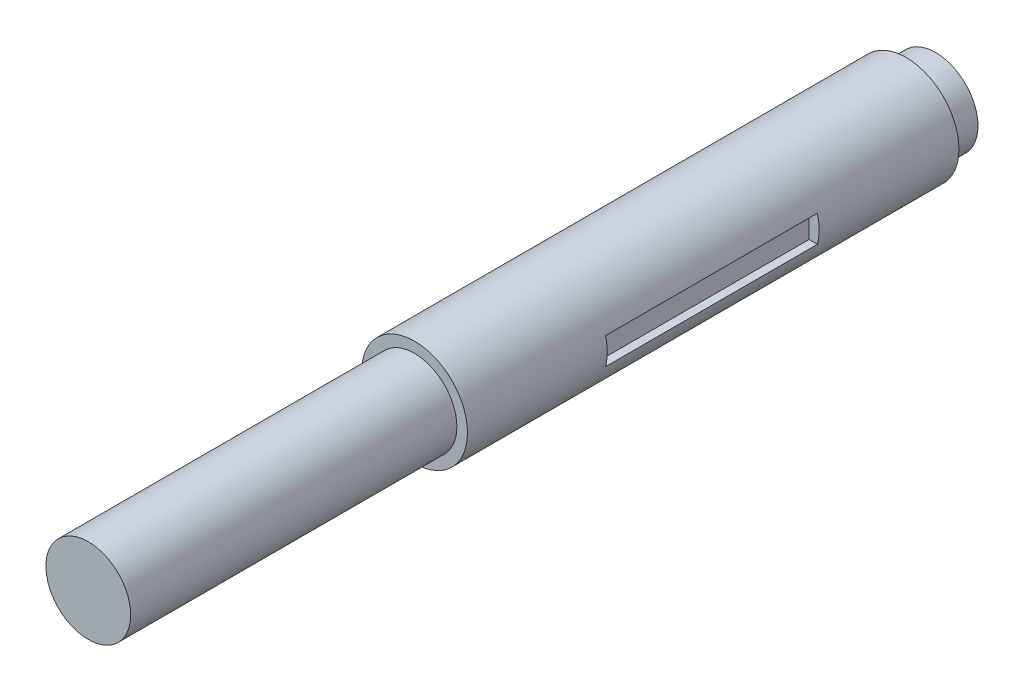
ISO-10303-21;
HEADER;
FILE_DESCRIPTION(('STEP AP214'),'2;1');
FILE_NAME('part.step','',(''),(''),'','','');
FILE_SCHEMA(('AUTOMOTIVE_DESIGN { 1 0 10303 214 1 1 1 1 }'));
ENDSEC;
DATA;
#1=APPLICATION_CONTEXT('core data for automotive mechanical design processes');
#2=APPLICATION_PROTOCOL_DEFINITION('international standard','automotive_design',2000,#1);
#3=PRODUCT_CONTEXT('',#1,'mechanical');
#4=PRODUCT('Part','Part','',(#3));
#5=PRODUCT_RELATED_PRODUCT_CATEGORY('part','',(#4));
#6=PRODUCT_DEFINITION_FORMATION('','',#4);
#7=PRODUCT_DEFINITION_CONTEXT('part definition',#1,'design');
#8=PRODUCT_DEFINITION('design','',#6,#7);
#9=PRODUCT_DEFINITION_SHAPE('','',#8);
#10=(LENGTH_UNIT() NAMED_UNIT(*) SI_UNIT(.MILLI.,.METRE.));
#11=(NAMED_UNIT(*) PLANE_ANGLE_UNIT() SI_UNIT($,.RADIAN.));
#12=(NAMED_UNIT(*) SI_UNIT($,.STERADIAN.) SOLID_ANGLE_UNIT());
#13=UNCERTAINTY_MEASURE_WITH_UNIT(LENGTH_MEASURE(1.E-05),#10,'distance_accuracy_value','');
#14=(GEOMETRIC_REPRESENTATION_CONTEXT(3) GLOBAL_UNCERTAINTY_ASSIGNED_CONTEXT((#13)) GLOBAL_UNIT_ASSIGNED_CONTEXT((#10,
#11,#12)) REPRESENTATION_CONTEXT('',''));
#15=CARTESIAN_POINT('',(0.,0.,0.));
#16=DIRECTION('',(0.,0.,1.));
#17=DIRECTION('',(1.,0.,0.));
#18=AXIS2_PLACEMENT_3D('',#15,#16,#17);
#19=CARTESIAN_POINT('',(0.,0.,0.));
#20=DIRECTION('',(0.,0.,1.));
#21=DIRECTION('',(1.,0.,0.));
#22=AXIS2_PLACEMENT_3D('',#19,#20,#21);
#23=PLANE('',#22);
#24=CARTESIAN_POINT('',(0.,0.,0.));
#25=DIRECTION('',(0.,0.,1.));
#26=DIRECTION('',(1.,0.,0.));
#27=AXIS2_PLACEMENT_3D('',#24,#25,#26);
#28=CIRCLE('',#27,12.5);
#29=CARTESIAN_POINT('',(12.5,0.,0.));
#30=VERTEX_POINT('',#29);
#31=EDGE_CURVE('E112',#30,#30,#28,.T.);
#32=ORIENTED_EDGE('',*,*,#31,.F.);
#33=EDGE_LOOP('',(#32));
#34=FACE_BOUND('',#33,.T.);
#35=CARTESIAN_POINT('',(0.,0.,0.));
#36=DIRECTION('',(0.,0.,1.));
#37=DIRECTION('',(1.,0.,0.));
#38=AXIS2_PLACEMENT_3D('',#35,#36,#37);
#39=CIRCLE('',#38,10.);
#40=CARTESIAN_POINT('',(10.,0.,0.));
#41=VERTEX_POINT('',#40);
#42=EDGE_CURVE('E116',#41,#41,#39,.F.);
#43=ORIENTED_EDGE('',*,*,#42,.F.);
#44=EDGE_LOOP('',(#43));
#45=FACE_BOUND('',#44,.T.);
#46=ADVANCED_FACE('F33',(#34,#45),#23,.F.);
#47=CARTESIAN_POINT('',(0.,0.,116.));
#48=DIRECTION('',(0.,0.,1.));
#49=DIRECTION('',(1.,0.,0.));
#50=AXIS2_PLACEMENT_3D('',#47,#48,#49);
#51=PLANE('',#50);
#52=CARTESIAN_POINT('',(0.,0.,116.));
#53=DIRECTION('',(0.,0.,1.));
#54=DIRECTION('',(1.,0.,0.));
#55=AXIS2_PLACEMENT_3D('',#52,#53,#54);
#56=CIRCLE('',#55,12.5);
#57=CARTESIAN_POINT('',(12.5,0.,116.));
#58=VERTEX_POINT('',#57);
#59=EDGE_CURVE('E113',#58,#58,#56,.T.);
#60=ORIENTED_EDGE('',*,*,#59,.T.);
#61=EDGE_LOOP('',(#60));
#62=FACE_BOUND('',#61,.T.);
#63=CARTESIAN_POINT('',(0.,0.,116.));
#64=DIRECTION('',(0.,0.,1.));
#65=DIRECTION('',(1.,0.,0.));
#66=AXIS2_PLACEMENT_3D('',#63,#64,#65);
#67=CIRCLE('',#66,10.);
#68=CARTESIAN_POINT('',(10.,0.,116.));
#69=VERTEX_POINT('',#68);
#70=EDGE_CURVE('E109',#69,#69,#67,.T.);
#71=ORIENTED_EDGE('',*,*,#70,.F.);
#72=EDGE_LOOP('',(#71));
#73=FACE_BOUND('',#72,.T.);
#74=ADVANCED_FACE('F139',(#62,#73),#51,.T.);
#75=CARTESIAN_POINT('',(0.,0.,116.));
#76=DIRECTION('',(0.,0.,-1.));
#77=DIRECTION('',(-1.,0.,0.));
#78=AXIS2_PLACEMENT_3D('',#75,#76,#77);
#79=CYLINDRICAL_SURFACE('',#78,12.5);
#80=CARTESIAN_POINT('',(0.,0.,83.));
#81=DIRECTION('',(0.,0.,1.));
#82=DIRECTION('',(1.,0.,0.));
#83=AXIS2_PLACEMENT_3D('',#80,#81,#82);
#84=CIRCLE('',#83,12.5);
#85=CARTESIAN_POINT('',(12.0900527294135,-3.175,83.));
#86=VERTEX_POINT('',#85);
#87=CARTESIAN_POINT('',(12.0900527294135,3.17499999999999,83.));
#88=VERTEX_POINT('',#87);
#89=EDGE_CURVE('E121',#86,#88,#84,.T.);
#90=ORIENTED_EDGE('',*,*,#89,.T.);
#91=DIRECTION('',(0.,0.,-1.));
#92=VECTOR('',#91,1.);
#93=CARTESIAN_POINT('',(12.0900527294135,3.17499999999999,116.));
#94=LINE('',#93,#92);
#95=CARTESIAN_POINT('',(12.0900527294135,3.175,33.));
#96=VERTEX_POINT('',#95);
#97=EDGE_CURVE('E11',#88,#96,#94,.T.);
#98=ORIENTED_EDGE('',*,*,#97,.T.);
#99=CARTESIAN_POINT('',(0.,0.,33.));
#100=DIRECTION('',(0.,0.,-1.));
#101=DIRECTION('',(-1.,0.,0.));
#102=AXIS2_PLACEMENT_3D('',#99,#100,#101);
#103=CIRCLE('',#102,12.5);
#104=CARTESIAN_POINT('',(12.0900527294135,-3.175,33.));
#105=VERTEX_POINT('',#104);
#106=EDGE_CURVE('E41',#96,#105,#103,.T.);
#107=ORIENTED_EDGE('',*,*,#106,.T.);
#108=DIRECTION('',(0.,0.,-1.));
#109=VECTOR('',#108,1.);
#110=CARTESIAN_POINT('',(12.0900527294135,-3.17500000000001,116.));
#111=LINE('',#110,#109);
#112=EDGE_CURVE('E55',#105,#86,#111,.F.);
#113=ORIENTED_EDGE('',*,*,#112,.T.);
#114=EDGE_LOOP('',(#90,#98,#107,#113));
#115=FACE_BOUND('',#114,.T.);
#116=ORIENTED_EDGE('',*,*,#59,.F.);
#117=EDGE_LOOP('',(#116));
#118=FACE_BOUND('',#117,.T.);
#119=ORIENTED_EDGE('',*,*,#31,.T.);
#120=EDGE_LOOP('',(#119));
#121=FACE_BOUND('',#120,.T.);
#122=ADVANCED_FACE('F35',(#115,#118,#121),#79,.T.);
#123=CARTESIAN_POINT('',(0.,0.,123.));
#124=DIRECTION('',(0.,0.,-1.));
#125=DIRECTION('',(-1.,0.,0.));
#126=AXIS2_PLACEMENT_3D('',#123,#124,#125);
#127=CYLINDRICAL_SURFACE('',#126,10.);
#128=ORIENTED_EDGE('',*,*,#70,.T.);
#129=EDGE_LOOP('',(#128));
#130=FACE_BOUND('',#129,.T.);
#131=CARTESIAN_POINT('',(0.,0.,193.));
#132=DIRECTION('',(0.,0.,1.));
#133=DIRECTION('',(1.,0.,0.));
#134=AXIS2_PLACEMENT_3D('',#131,#132,#133);
#135=CIRCLE('',#134,10.);
#136=CARTESIAN_POINT('',(10.,0.,193.));
#137=VERTEX_POINT('',#136);
#138=EDGE_CURVE('E94',#137,#137,#135,.T.);
#139=ORIENTED_EDGE('',*,*,#138,.F.);
#140=EDGE_LOOP('',(#139));
#141=FACE_BOUND('',#140,.T.);
#142=ADVANCED_FACE('F149',(#130,#141),#127,.T.);
#143=CARTESIAN_POINT('',(0.,0.,-7.));
#144=DIRECTION('',(0.,0.,1.));
#145=DIRECTION('',(1.,0.,0.));
#146=AXIS2_PLACEMENT_3D('',#143,#144,#145);
#147=CYLINDRICAL_SURFACE('',#146,10.);
#148=CARTESIAN_POINT('',(0.,0.,-7.));
#149=DIRECTION('',(0.,0.,-1.));
#150=DIRECTION('',(-1.,0.,0.));
#151=AXIS2_PLACEMENT_3D('',#148,#149,#150);
#152=CIRCLE('',#151,10.);
#153=CARTESIAN_POINT('',(-10.,0.,-7.));
#154=VERTEX_POINT('',#153);
#155=EDGE_CURVE('E103',#154,#154,#152,.T.);
#156=ORIENTED_EDGE('',*,*,#155,.F.);
#157=EDGE_LOOP('',(#156));
#158=FACE_BOUND('',#157,.T.);
#159=ORIENTED_EDGE('',*,*,#42,.T.);
#160=EDGE_LOOP('',(#159));
#161=FACE_BOUND('',#160,.T.);
#162=ADVANCED_FACE('F152',(#158,#161),#147,.T.);
#163=CARTESIAN_POINT('',(0.,0.,-7.));
#164=DIRECTION('',(0.,0.,-1.));
#165=DIRECTION('',(-1.,0.,0.));
#166=AXIS2_PLACEMENT_3D('',#163,#164,#165);
#167=PLANE('',#166);
#168=ORIENTED_EDGE('',*,*,#155,.T.);
#169=EDGE_LOOP('',(#168));
#170=FACE_BOUND('',#169,.T.);
#171=ADVANCED_FACE('F135',(#170),#167,.T.);
#172=CARTESIAN_POINT('',(10.11875,3.175,33.));
#173=DIRECTION('',(0.,0.,-1.));
#174=DIRECTION('',(-1.,0.,0.));
#175=AXIS2_PLACEMENT_3D('',#172,#173,#174);
#176=PLANE('',#175);
#177=DIRECTION('',(1.,0.,0.));
#178=VECTOR('',#177,1.);
#179=CARTESIAN_POINT('',(10.11875,3.175,33.));
#180=LINE('',#179,#178);
#181=CARTESIAN_POINT('',(10.11875,3.175,33.));
#182=VERTEX_POINT('',#181);
#183=EDGE_CURVE('E72',#182,#96,#180,.T.);
#184=ORIENTED_EDGE('',*,*,#183,.F.);
#185=DIRECTION('',(0.,1.,0.));
#186=VECTOR('',#185,1.);
#187=CARTESIAN_POINT('',(10.11875,3.175,33.));
#188=LINE('',#187,#186);
#189=CARTESIAN_POINT('',(10.11875,-3.175,33.));
#190=VERTEX_POINT('',#189);
#191=EDGE_CURVE('E76',#190,#182,#188,.T.);
#192=ORIENTED_EDGE('',*,*,#191,.F.);
#193=DIRECTION('',(1.,0.,0.));
#194=VECTOR('',#193,1.);
#195=CARTESIAN_POINT('',(10.11875,-3.175,33.));
#196=LINE('',#195,#194);
#197=EDGE_CURVE('E101',#190,#105,#196,.T.);
#198=ORIENTED_EDGE('',*,*,#197,.T.);
#199=ORIENTED_EDGE('',*,*,#106,.F.);
#200=EDGE_LOOP('',(#184,#192,#198,#199));
#201=FACE_BOUND('',#200,.T.);
#202=ADVANCED_FACE('F74',(#201),#176,.F.);
#203=CARTESIAN_POINT('',(10.11875,-3.175,33.));
#204=DIRECTION('',(0.,-1.,0.));
#205=DIRECTION('',(0.,0.,-1.));
#206=AXIS2_PLACEMENT_3D('',#203,#204,#205);
#207=PLANE('',#206);
#208=ORIENTED_EDGE('',*,*,#197,.F.);
#209=DIRECTION('',(0.,0.,-1.));
#210=VECTOR('',#209,1.);
#211=CARTESIAN_POINT('',(10.11875,-3.175,33.));
#212=LINE('',#211,#210);
#213=CARTESIAN_POINT('',(10.11875,-3.17500000000001,83.));
#214=VERTEX_POINT('',#213);
#215=EDGE_CURVE('E81',#214,#190,#212,.T.);
#216=ORIENTED_EDGE('',*,*,#215,.F.);
#217=DIRECTION('',(1.,0.,0.));
#218=VECTOR('',#217,1.);
#219=CARTESIAN_POINT('',(10.11875,-3.17500000000001,83.));
#220=LINE('',#219,#218);
#221=EDGE_CURVE('E104',#214,#86,#220,.T.);
#222=ORIENTED_EDGE('',*,*,#221,.T.);
#223=ORIENTED_EDGE('',*,*,#112,.F.);
#224=EDGE_LOOP('',(#208,#216,#222,#223));
#225=FACE_BOUND('',#224,.T.);
#226=ADVANCED_FACE('F127',(#225),#207,.F.);
#227=CARTESIAN_POINT('',(10.11875,3.17499999999999,83.));
#228=DIRECTION('',(0.,0.,1.));
#229=DIRECTION('',(1.,0.,0.));
#230=AXIS2_PLACEMENT_3D('',#227,#228,#229);
#231=PLANE('',#230);
#232=ORIENTED_EDGE('',*,*,#89,.F.);
#233=ORIENTED_EDGE('',*,*,#221,.F.);
#234=DIRECTION('',(0.,-1.,0.));
#235=VECTOR('',#234,1.);
#236=CARTESIAN_POINT('',(10.11875,3.17499999999999,83.));
#237=LINE('',#236,#235);
#238=CARTESIAN_POINT('',(10.11875,3.17499999999999,83.));
#239=VERTEX_POINT('',#238);
#240=EDGE_CURVE('E90',#239,#214,#237,.T.);
#241=ORIENTED_EDGE('',*,*,#240,.F.);
#242=DIRECTION('',(1.,0.,0.));
#243=VECTOR('',#242,1.);
#244=CARTESIAN_POINT('',(10.11875,3.17499999999999,83.));
#245=LINE('',#244,#243);
#246=EDGE_CURVE('E80',#239,#88,#245,.T.);
#247=ORIENTED_EDGE('',*,*,#246,.T.);
#248=EDGE_LOOP('',(#232,#233,#241,#247));
#249=FACE_BOUND('',#248,.T.);
#250=ADVANCED_FACE('F126',(#249),#231,.F.);
#251=CARTESIAN_POINT('',(10.11875,3.175,33.));
#252=DIRECTION('',(0.,1.,0.));
#253=DIRECTION('',(0.,0.,1.));
#254=AXIS2_PLACEMENT_3D('',#251,#252,#253);
#255=PLANE('',#254);
#256=ORIENTED_EDGE('',*,*,#246,.F.);
#257=DIRECTION('',(0.,0.,1.));
#258=VECTOR('',#257,1.);
#259=CARTESIAN_POINT('',(10.11875,3.175,33.));
#260=LINE('',#259,#258);
#261=EDGE_CURVE('E84',#182,#239,#260,.T.);
#262=ORIENTED_EDGE('',*,*,#261,.F.);
#263=ORIENTED_EDGE('',*,*,#183,.T.);
#264=ORIENTED_EDGE('',*,*,#97,.F.);
#265=EDGE_LOOP('',(#256,#262,#263,#264));
#266=FACE_BOUND('',#265,.T.);
#267=ADVANCED_FACE('F85',(#266),#255,.F.);
#268=CARTESIAN_POINT('',(10.11875,0.,0.));
#269=DIRECTION('',(-1.,0.,0.));
#270=DIRECTION('',(0.,0.,1.));
#271=AXIS2_PLACEMENT_3D('',#268,#269,#270);
#272=PLANE('',#271);
#273=ORIENTED_EDGE('',*,*,#191,.T.);
#274=ORIENTED_EDGE('',*,*,#261,.T.);
#275=ORIENTED_EDGE('',*,*,#240,.T.);
#276=ORIENTED_EDGE('',*,*,#215,.T.);
#277=EDGE_LOOP('',(#273,#274,#275,#276));
#278=FACE_BOUND('',#277,.T.);
#279=ADVANCED_FACE('F92',(#278),#272,.F.);
#280=CARTESIAN_POINT('',(0.,0.,193.));
#281=DIRECTION('',(0.,0.,1.));
#282=DIRECTION('',(1.,0.,0.));
#283=AXIS2_PLACEMENT_3D('',#280,#281,#282);
#284=PLANE('',#283);
#285=ORIENTED_EDGE('',*,*,#138,.T.);
#286=EDGE_LOOP('',(#285));
#287=FACE_BOUND('',#286,.T.);
#288=ADVANCED_FACE('F164',(#287),#284,.T.);
#289=CLOSED_SHELL('',(#46,#74,#122,#142,#162,#171,#202,#226,#250,#267,#279,#288));
#290=MANIFOLD_SOLID_BREP('B2',#289);
#291=ADVANCED_BREP_SHAPE_REPRESENTATION('',(#18,#290),#14);
#292=SHAPE_DEFINITION_REPRESENTATION(#9,#291);
ENDSEC;
END-ISO-10303-21;
